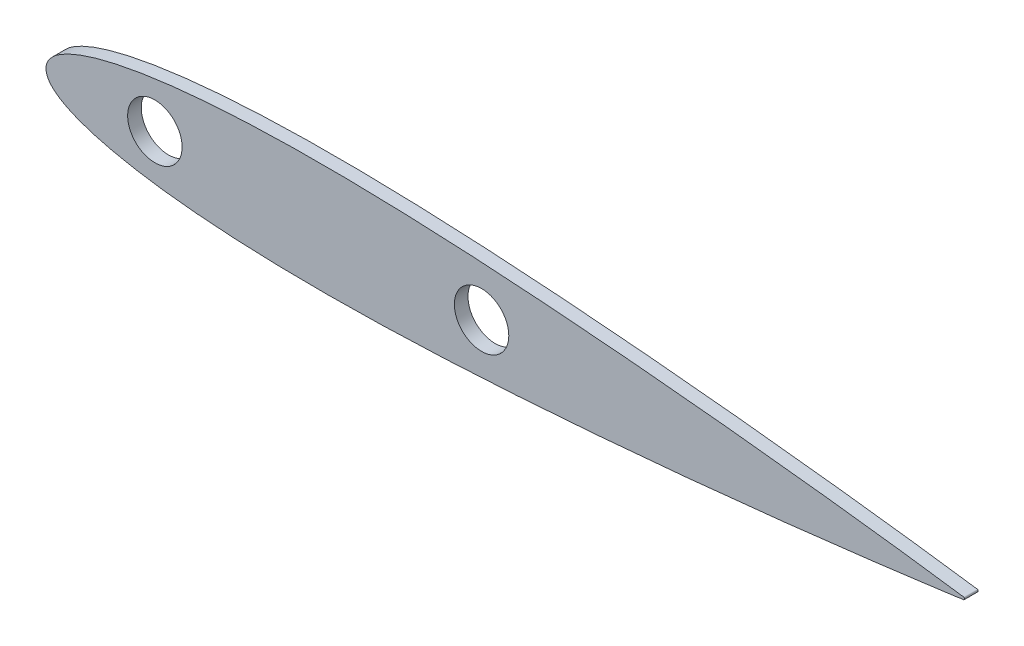
ISO-10303-21;
HEADER;
FILE_DESCRIPTION(('STEP AP214'),'2;1');
FILE_NAME('part.step','',(''),(''),'','','');
FILE_SCHEMA(('AUTOMOTIVE_DESIGN { 1 0 10303 214 1 1 1 1 }'));
ENDSEC;
DATA;
#1=APPLICATION_CONTEXT('core data for automotive mechanical design processes');
#2=APPLICATION_PROTOCOL_DEFINITION('international standard','automotive_design',2000,#1);
#3=PRODUCT_CONTEXT('',#1,'mechanical');
#4=PRODUCT('Part','Part','',(#3));
#5=PRODUCT_RELATED_PRODUCT_CATEGORY('part','',(#4));
#6=PRODUCT_DEFINITION_FORMATION('','',#4);
#7=PRODUCT_DEFINITION_CONTEXT('part definition',#1,'design');
#8=PRODUCT_DEFINITION('design','',#6,#7);
#9=PRODUCT_DEFINITION_SHAPE('','',#8);
#10=(LENGTH_UNIT() NAMED_UNIT(*) SI_UNIT(.MILLI.,.METRE.));
#11=(NAMED_UNIT(*) PLANE_ANGLE_UNIT() SI_UNIT($,.RADIAN.));
#12=(NAMED_UNIT(*) SI_UNIT($,.STERADIAN.) SOLID_ANGLE_UNIT());
#13=UNCERTAINTY_MEASURE_WITH_UNIT(LENGTH_MEASURE(1.E-05),#10,'distance_accuracy_value','');
#14=(GEOMETRIC_REPRESENTATION_CONTEXT(3) GLOBAL_UNCERTAINTY_ASSIGNED_CONTEXT((#13)) GLOBAL_UNIT_ASSIGNED_CONTEXT((#10,
#11,#12)) REPRESENTATION_CONTEXT('',''));
#15=CARTESIAN_POINT('',(0.,0.,0.));
#16=DIRECTION('',(0.,0.,1.));
#17=DIRECTION('',(1.,0.,0.));
#18=AXIS2_PLACEMENT_3D('',#15,#16,#17);
#19=CARTESIAN_POINT('',(214.122,0.26979372,-3.175));
#20=CARTESIAN_POINT('',(214.042517560815,0.336401081243854,-3.175));
#21=CARTESIAN_POINT('',(213.528971008812,0.273510813659236,-3.175));
#22=CARTESIAN_POINT('',(212.614475706084,0.530942112134174,-3.175));
#23=CARTESIAN_POINT('',(210.93741297643,0.69005818023402,-3.175));
#24=CARTESIAN_POINT('',(208.678154780773,1.03154078288429,-3.175));
#25=CARTESIAN_POINT('',(205.767891793944,1.41261255706814,-3.175));
#26=CARTESIAN_POINT('',(202.258298365244,1.8822660000615,-3.175));
#27=CARTESIAN_POINT('',(198.15850540465,2.41316460028215,-3.175));
#28=CARTESIAN_POINT('',(193.498201345533,3.00425135927741,-3.175));
#29=CARTESIAN_POINT('',(188.304622899694,3.64517141354976,-3.175));
#30=CARTESIAN_POINT('',(182.610259265293,4.32725083103619,-3.175));
#31=CARTESIAN_POINT('',(176.450111776307,5.04202983623907,-3.175));
#32=CARTESIAN_POINT('',(169.862114854153,5.77977689195638,-3.175));
#33=CARTESIAN_POINT('',(162.886908751652,6.53148470383703,-3.175));
#34=CARTESIAN_POINT('',(155.567547263004,7.28781696456526,-3.175));
#35=CARTESIAN_POINT('',(147.949138879147,8.03901128357458,-3.175));
#36=CARTESIAN_POINT('',(140.078674392034,8.77452314910697,-3.175));
#37=CARTESIAN_POINT('',(132.004623531841,9.48469680818573,-3.175));
#38=CARTESIAN_POINT('',(123.77685377293,10.1576594283105,-3.175));
#39=CARTESIAN_POINT('',(115.445921161842,10.7824383271029,-3.175));
#40=CARTESIAN_POINT('',(107.063264355407,11.3474339858058,-3.175));
#41=CARTESIAN_POINT('',(98.6805322459567,11.8408328326721,-3.175));
#42=CARTESIAN_POINT('',(90.3493308385156,12.2501697678435,-3.175));
#43=CARTESIAN_POINT('',(82.1211133669292,12.5645294411525,-3.175));
#44=CARTESIAN_POINT('',(74.0463721558162,12.7736562598864,-3.175));
#45=CARTESIAN_POINT('',(66.1750074581299,12.8673356782165,-3.175));
#46=CARTESIAN_POINT('',(58.5553855531777,12.8381332578879,-3.175));
#47=CARTESIAN_POINT('',(51.2344833966952,12.6804083153224,-3.175));
#48=CARTESIAN_POINT('',(44.257364483312,12.390162695652,-3.175));
#49=CARTESIAN_POINT('',(37.6669743171648,11.966637161581,-3.175));
#50=CARTESIAN_POINT('',(31.5038176761954,11.4111060734603,-3.175));
#51=CARTESIAN_POINT('',(25.8056086917366,10.7279081528874,-3.175));
#52=CARTESIAN_POINT('',(20.6070797735584,9.92285640303968,-3.175));
#53=CARTESIAN_POINT('',(15.9397327494157,9.00435890137932,-3.175));
#54=CARTESIAN_POINT('',(11.8309235824545,7.98280134436973,-3.175));
#55=CARTESIAN_POINT('',(8.30400030891142,6.86814519210064,-3.175));
#56=CARTESIAN_POINT('',(5.37688201303167,5.67077191854433,-3.175));
#57=CARTESIAN_POINT('',(3.05890335649716,4.39878231679485,-3.175));
#58=CARTESIAN_POINT('',(1.35363115596886,3.04966587168943,-3.175));
#59=CARTESIAN_POINT('',(0.261418185550571,1.59078439078852,-3.175));
#60=CARTESIAN_POINT('',(-0.121830169011358,0.,-3.175));
#61=CARTESIAN_POINT('',(0.261418185550567,-1.5907843907885,-3.175));
#62=CARTESIAN_POINT('',(1.35363115596885,-3.04966587168942,-3.175));
#63=CARTESIAN_POINT('',(3.05890335649717,-4.39878231679486,-3.175));
#64=CARTESIAN_POINT('',(5.37688201303168,-5.67077191854434,-3.175));
#65=CARTESIAN_POINT('',(8.30400030891139,-6.86814519210063,-3.175));
#66=CARTESIAN_POINT('',(11.8309235824545,-7.98280134436973,-3.175));
#67=CARTESIAN_POINT('',(15.9397327494157,-9.00435890137932,-3.175));
#68=CARTESIAN_POINT('',(20.6070797735584,-9.92285640303967,-3.175));
#69=CARTESIAN_POINT('',(25.8056086917366,-10.7279081528874,-3.175));
#70=CARTESIAN_POINT('',(31.5038176761954,-11.4111060734603,-3.175));
#71=CARTESIAN_POINT('',(37.6669743171648,-11.966637161581,-3.175));
#72=CARTESIAN_POINT('',(44.257364483312,-12.390162695652,-3.175));
#73=CARTESIAN_POINT('',(51.2344833966952,-12.6804083153224,-3.175));
#74=CARTESIAN_POINT('',(58.5553855531778,-12.8381332578879,-3.175));
#75=CARTESIAN_POINT('',(66.1750074581299,-12.8673356782165,-3.175));
#76=CARTESIAN_POINT('',(74.0463721558162,-12.7736562598864,-3.175));
#77=CARTESIAN_POINT('',(82.1211133669292,-12.5645294411525,-3.175));
#78=CARTESIAN_POINT('',(90.3493308385156,-12.2501697678435,-3.175));
#79=CARTESIAN_POINT('',(98.6805322459566,-11.8408328326721,-3.175));
#80=CARTESIAN_POINT('',(107.063264355407,-11.3474339858058,-3.175));
#81=CARTESIAN_POINT('',(115.445921161842,-10.7824383271029,-3.175));
#82=CARTESIAN_POINT('',(123.77685377293,-10.1576594283105,-3.175));
#83=CARTESIAN_POINT('',(132.004623531841,-9.48469680818572,-3.175));
#84=CARTESIAN_POINT('',(140.078674392034,-8.77452314910697,-3.175));
#85=CARTESIAN_POINT('',(147.949138879147,-8.03901128357458,-3.175));
#86=CARTESIAN_POINT('',(155.567547263004,-7.28781696456527,-3.175));
#87=CARTESIAN_POINT('',(162.886908751652,-6.53148470383702,-3.175));
#88=CARTESIAN_POINT('',(169.862114854153,-5.77977689195639,-3.175));
#89=CARTESIAN_POINT('',(176.450111776307,-5.04202983623907,-3.175));
#90=CARTESIAN_POINT('',(182.610259265293,-4.32725083103619,-3.175));
#91=CARTESIAN_POINT('',(188.304622899694,-3.64517141354977,-3.175));
#92=CARTESIAN_POINT('',(193.498201345533,-3.0042513592774,-3.175));
#93=CARTESIAN_POINT('',(198.15850540465,-2.41316460028216,-3.175));
#94=CARTESIAN_POINT('',(202.258298365244,-1.8822660000615,-3.175));
#95=CARTESIAN_POINT('',(205.767891793944,-1.41261255706814,-3.175));
#96=CARTESIAN_POINT('',(208.678154780773,-1.0315407828843,-3.175));
#97=CARTESIAN_POINT('',(210.937412976431,-0.69005818023401,-3.175));
#98=CARTESIAN_POINT('',(212.614475706083,-0.530942112134185,-3.175));
#99=CARTESIAN_POINT('',(213.528971008813,-0.273510813659228,-3.175));
#100=CARTESIAN_POINT('',(214.250719430012,-0.361898032229822,-3.175));
#101=CARTESIAN_POINT('',(214.250719430012,0.161925093145306,-3.175));
#102=CARTESIAN_POINT('',(214.122,0.26979372,-3.175));
#103=B_SPLINE_CURVE_WITH_KNOTS('',3,(#19,#20,#21,#22,#23,#24,#25,#26,#27,#28,#29,#30,#31,#32,
#33,#34,#35,#36,#37,#38,#39,#40,#41,#42,#43,#44,#45,#46,#47,#48,#49,#50,#51,#52,#53,#54,#55,#56,
#57,#58,#59,#60,#61,#62,#63,#64,#65,#66,#67,#68,#69,#70,#71,#72,#73,#74,#75,#76,#77,#78,#79,#80,
#81,#82,#83,#84,#85,#86,#87,#88,#89,#90,#91,#92,#93,#94,#95,#96,#97,#98,#99,#100,#101,#102),
.UNSPECIFIED.,.T.,.F.,(4,1,1,1,1,1,1,1,1,1,1,1,1,1,1,1,1,1,1,1,1,1,1,1,1,1,1,1,1,1,1,1,1,1,1,1,
1,1,1,1,1,1,1,1,1,1,1,1,1,1,1,1,1,1,1,1,1,1,1,1,1,1,1,1,1,1,1,1,1,1,1,1,1,1,1,1,1,1,1,1,1,4),
(0.,0.000762214651028502,0.00304470631082166,0.00683224554312915,0.0121011758037585,
0.0188175356586857,0.026939454793122,0.0364148482585567,0.0471846285955963,0.0591804130998147,
0.0723278736139124,0.0865440610891482,0.101740580336553,0.117823336433574,0.134691452208322,
0.152240154447154,0.170361289964637,0.188941007849542,0.207865435445639,0.227016078022501,
0.246275695980001,0.265524943249895,0.284644966110444,0.303520118268661,0.322034575374331,
0.340078352914118,0.357542593241702,0.374325481920834,0.390329890871888,0.405463889739094,
0.419643801445684,0.43279337139134,0.444843816743186,0.455737920704734,0.465428653233084,
0.473886320085415,0.481101634077568,0.487101684418678,0.491975368345093,0.495930677807379,
0.499382808099288,0.502834938391197,0.506790247853483,0.511663931779898,0.517663982121008,
0.524879296113161,0.533336962965492,0.543027695493842,0.55392179945539,0.565972244807236,
0.579121814752892,0.593301726459482,0.608435725326688,0.624440134277742,0.641223022956874,
0.658687263284458,0.676731040824245,0.695245497929915,0.714120650088133,0.733240672948681,
0.752489920218576,0.771749538176075,0.790900180752937,0.809824608349034,0.82840432623394,
0.846525461751422,0.864074163990254,0.880942279765002,0.897025035862024,0.912221555109428,
0.926437742584664,0.939585203098762,0.95158098760298,0.96235076794002,0.971826161405454,
0.979948080539891,0.986664440394818,0.991933370655447,0.995720909887755,0.998003401547548,
0.998765616198576,1.),.UNSPECIFIED.);
#104=DIRECTION('',(0.,0.,1.));
#105=VECTOR('',#104,1.);
#106=SURFACE_OF_LINEAR_EXTRUSION('',#103,#105);
#107=CARTESIAN_POINT('',(214.122,0.26979372,-3.175));
#108=VERTEX_POINT('',#107);
#109=EDGE_CURVE('E10',#108,#108,#103,.T.);
#110=ORIENTED_EDGE('',*,*,#109,.T.);
#111=EDGE_LOOP('',(#110));
#112=FACE_BOUND('',#111,.T.);
#113=CARTESIAN_POINT('',(214.122,0.26979372,0.));
#114=CARTESIAN_POINT('',(214.042517560815,0.336401081243854,0.));
#115=CARTESIAN_POINT('',(213.528971008812,0.273510813659236,0.));
#116=CARTESIAN_POINT('',(212.614475706084,0.530942112134174,0.));
#117=CARTESIAN_POINT('',(210.93741297643,0.69005818023402,0.));
#118=CARTESIAN_POINT('',(208.678154780773,1.03154078288429,0.));
#119=CARTESIAN_POINT('',(205.767891793944,1.41261255706814,0.));
#120=CARTESIAN_POINT('',(202.258298365244,1.8822660000615,0.));
#121=CARTESIAN_POINT('',(198.15850540465,2.41316460028215,0.));
#122=CARTESIAN_POINT('',(193.498201345533,3.00425135927741,0.));
#123=CARTESIAN_POINT('',(188.304622899694,3.64517141354976,0.));
#124=CARTESIAN_POINT('',(182.610259265293,4.32725083103619,0.));
#125=CARTESIAN_POINT('',(176.450111776307,5.04202983623907,0.));
#126=CARTESIAN_POINT('',(169.862114854153,5.77977689195638,0.));
#127=CARTESIAN_POINT('',(162.886908751652,6.53148470383703,0.));
#128=CARTESIAN_POINT('',(155.567547263004,7.28781696456526,0.));
#129=CARTESIAN_POINT('',(147.949138879147,8.03901128357458,0.));
#130=CARTESIAN_POINT('',(140.078674392034,8.77452314910697,0.));
#131=CARTESIAN_POINT('',(132.004623531841,9.48469680818573,0.));
#132=CARTESIAN_POINT('',(123.77685377293,10.1576594283105,0.));
#133=CARTESIAN_POINT('',(115.445921161842,10.7824383271029,0.));
#134=CARTESIAN_POINT('',(107.063264355407,11.3474339858058,0.));
#135=CARTESIAN_POINT('',(98.6805322459567,11.8408328326721,0.));
#136=CARTESIAN_POINT('',(90.3493308385156,12.2501697678435,0.));
#137=CARTESIAN_POINT('',(82.1211133669292,12.5645294411525,0.));
#138=CARTESIAN_POINT('',(74.0463721558162,12.7736562598864,0.));
#139=CARTESIAN_POINT('',(66.1750074581299,12.8673356782165,0.));
#140=CARTESIAN_POINT('',(58.5553855531777,12.8381332578879,0.));
#141=CARTESIAN_POINT('',(51.2344833966952,12.6804083153224,0.));
#142=CARTESIAN_POINT('',(44.257364483312,12.390162695652,0.));
#143=CARTESIAN_POINT('',(37.6669743171648,11.966637161581,0.));
#144=CARTESIAN_POINT('',(31.5038176761954,11.4111060734603,0.));
#145=CARTESIAN_POINT('',(25.8056086917366,10.7279081528874,0.));
#146=CARTESIAN_POINT('',(20.6070797735584,9.92285640303968,0.));
#147=CARTESIAN_POINT('',(15.9397327494157,9.00435890137932,0.));
#148=CARTESIAN_POINT('',(11.8309235824545,7.98280134436973,0.));
#149=CARTESIAN_POINT('',(8.30400030891142,6.86814519210064,0.));
#150=CARTESIAN_POINT('',(5.37688201303167,5.67077191854433,0.));
#151=CARTESIAN_POINT('',(3.05890335649716,4.39878231679485,0.));
#152=CARTESIAN_POINT('',(1.35363115596886,3.04966587168943,0.));
#153=CARTESIAN_POINT('',(0.261418185550571,1.59078439078852,0.));
#154=CARTESIAN_POINT('',(-0.121830169011358,0.,0.));
#155=CARTESIAN_POINT('',(0.261418185550567,-1.5907843907885,0.));
#156=CARTESIAN_POINT('',(1.35363115596885,-3.04966587168942,0.));
#157=CARTESIAN_POINT('',(3.05890335649717,-4.39878231679486,0.));
#158=CARTESIAN_POINT('',(5.37688201303168,-5.67077191854434,0.));
#159=CARTESIAN_POINT('',(8.30400030891139,-6.86814519210063,0.));
#160=CARTESIAN_POINT('',(11.8309235824545,-7.98280134436973,0.));
#161=CARTESIAN_POINT('',(15.9397327494157,-9.00435890137932,0.));
#162=CARTESIAN_POINT('',(20.6070797735584,-9.92285640303967,0.));
#163=CARTESIAN_POINT('',(25.8056086917366,-10.7279081528874,0.));
#164=CARTESIAN_POINT('',(31.5038176761954,-11.4111060734603,0.));
#165=CARTESIAN_POINT('',(37.6669743171648,-11.966637161581,0.));
#166=CARTESIAN_POINT('',(44.257364483312,-12.390162695652,0.));
#167=CARTESIAN_POINT('',(51.2344833966952,-12.6804083153224,0.));
#168=CARTESIAN_POINT('',(58.5553855531778,-12.8381332578879,0.));
#169=CARTESIAN_POINT('',(66.1750074581299,-12.8673356782165,0.));
#170=CARTESIAN_POINT('',(74.0463721558162,-12.7736562598864,0.));
#171=CARTESIAN_POINT('',(82.1211133669292,-12.5645294411525,0.));
#172=CARTESIAN_POINT('',(90.3493308385156,-12.2501697678435,0.));
#173=CARTESIAN_POINT('',(98.6805322459566,-11.8408328326721,0.));
#174=CARTESIAN_POINT('',(107.063264355407,-11.3474339858058,0.));
#175=CARTESIAN_POINT('',(115.445921161842,-10.7824383271029,0.));
#176=CARTESIAN_POINT('',(123.77685377293,-10.1576594283105,0.));
#177=CARTESIAN_POINT('',(132.004623531841,-9.48469680818572,0.));
#178=CARTESIAN_POINT('',(140.078674392034,-8.77452314910697,0.));
#179=CARTESIAN_POINT('',(147.949138879147,-8.03901128357458,0.));
#180=CARTESIAN_POINT('',(155.567547263004,-7.28781696456527,0.));
#181=CARTESIAN_POINT('',(162.886908751652,-6.53148470383702,0.));
#182=CARTESIAN_POINT('',(169.862114854153,-5.77977689195639,0.));
#183=CARTESIAN_POINT('',(176.450111776307,-5.04202983623907,0.));
#184=CARTESIAN_POINT('',(182.610259265293,-4.32725083103619,0.));
#185=CARTESIAN_POINT('',(188.304622899694,-3.64517141354977,0.));
#186=CARTESIAN_POINT('',(193.498201345533,-3.0042513592774,0.));
#187=CARTESIAN_POINT('',(198.15850540465,-2.41316460028216,0.));
#188=CARTESIAN_POINT('',(202.258298365244,-1.8822660000615,0.));
#189=CARTESIAN_POINT('',(205.767891793944,-1.41261255706814,0.));
#190=CARTESIAN_POINT('',(208.678154780773,-1.0315407828843,0.));
#191=CARTESIAN_POINT('',(210.937412976431,-0.69005818023401,0.));
#192=CARTESIAN_POINT('',(212.614475706083,-0.530942112134185,0.));
#193=CARTESIAN_POINT('',(213.528971008813,-0.273510813659228,0.));
#194=CARTESIAN_POINT('',(214.250719430012,-0.361898032229822,0.));
#195=CARTESIAN_POINT('',(214.250719430012,0.161925093145306,0.));
#196=CARTESIAN_POINT('',(214.122,0.26979372,0.));
#197=B_SPLINE_CURVE_WITH_KNOTS('',3,(#113,#114,#115,#116,#117,#118,#119,#120,#121,#122,#123,
#124,#125,#126,#127,#128,#129,#130,#131,#132,#133,#134,#135,#136,#137,#138,#139,#140,#141,#142,
#143,#144,#145,#146,#147,#148,#149,#150,#151,#152,#153,#154,#155,#156,#157,#158,#159,#160,#161,
#162,#163,#164,#165,#166,#167,#168,#169,#170,#171,#172,#173,#174,#175,#176,#177,#178,#179,#180,
#181,#182,#183,#184,#185,#186,#187,#188,#189,#190,#191,#192,#193,#194,#195,#196),.UNSPECIFIED.,
.T.,.F.,(4,1,1,1,1,1,1,1,1,1,1,1,1,1,1,1,1,1,1,1,1,1,1,1,1,1,1,1,1,1,1,1,1,1,1,1,1,1,1,1,1,1,1,
1,1,1,1,1,1,1,1,1,1,1,1,1,1,1,1,1,1,1,1,1,1,1,1,1,1,1,1,1,1,1,1,1,1,1,1,1,1,4),(0.,
0.000762214651028502,0.00304470631082166,0.00683224554312915,0.0121011758037585,
0.0188175356586857,0.026939454793122,0.0364148482585567,0.0471846285955963,0.0591804130998147,
0.0723278736139124,0.0865440610891482,0.101740580336553,0.117823336433574,0.134691452208322,
0.152240154447154,0.170361289964637,0.188941007849542,0.207865435445639,0.227016078022501,
0.246275695980001,0.265524943249895,0.284644966110444,0.303520118268661,0.322034575374331,
0.340078352914118,0.357542593241702,0.374325481920834,0.390329890871888,0.405463889739094,
0.419643801445684,0.43279337139134,0.444843816743186,0.455737920704734,0.465428653233084,
0.473886320085415,0.481101634077568,0.487101684418678,0.491975368345093,0.495930677807379,
0.499382808099288,0.502834938391197,0.506790247853483,0.511663931779898,0.517663982121008,
0.524879296113161,0.533336962965492,0.543027695493842,0.55392179945539,0.565972244807236,
0.579121814752892,0.593301726459482,0.608435725326688,0.624440134277742,0.641223022956874,
0.658687263284458,0.676731040824245,0.695245497929915,0.714120650088133,0.733240672948681,
0.752489920218576,0.771749538176075,0.790900180752937,0.809824608349034,0.82840432623394,
0.846525461751422,0.864074163990254,0.880942279765002,0.897025035862024,0.912221555109428,
0.926437742584664,0.939585203098762,0.95158098760298,0.96235076794002,0.971826161405454,
0.979948080539891,0.986664440394818,0.991933370655447,0.995720909887755,0.998003401547548,
0.998765616198576,1.),.UNSPECIFIED.);
#198=CARTESIAN_POINT('',(214.122,0.26979372,0.));
#199=VERTEX_POINT('',#198);
#200=EDGE_CURVE('E39',#199,#199,#197,.T.);
#201=ORIENTED_EDGE('',*,*,#200,.F.);
#202=EDGE_LOOP('',(#201));
#203=FACE_BOUND('',#202,.T.);
#204=ADVANCED_FACE('F35',(#112,#203),#106,.T.);
#205=CARTESIAN_POINT('',(0.0114796345108349,-0.270976882837512,-3.175));
#206=DIRECTION('',(0.,0.,1.));
#207=DIRECTION('',(-1.,0.,0.));
#208=AXIS2_PLACEMENT_3D('',#205,#206,#207);
#209=PLANE('',#208);
#210=CARTESIAN_POINT('',(25.4,0.,-3.175));
#211=DIRECTION('',(0.,0.,1.));
#212=DIRECTION('',(1.,0.,0.));
#213=AXIS2_PLACEMENT_3D('',#210,#211,#212);
#214=CIRCLE('',#213,6.35);
#215=CARTESIAN_POINT('',(31.75,0.,-3.175));
#216=VERTEX_POINT('',#215);
#217=EDGE_CURVE('E61',#216,#216,#214,.T.);
#218=ORIENTED_EDGE('',*,*,#217,.T.);
#219=EDGE_LOOP('',(#218));
#220=FACE_BOUND('',#219,.T.);
#221=CARTESIAN_POINT('',(101.6,0.,-3.175));
#222=DIRECTION('',(0.,0.,1.));
#223=DIRECTION('',(1.,0.,0.));
#224=AXIS2_PLACEMENT_3D('',#221,#222,#223);
#225=CIRCLE('',#224,6.35);
#226=CARTESIAN_POINT('',(107.95,0.,-3.175));
#227=VERTEX_POINT('',#226);
#228=EDGE_CURVE('E52',#227,#227,#225,.T.);
#229=ORIENTED_EDGE('',*,*,#228,.T.);
#230=EDGE_LOOP('',(#229));
#231=FACE_BOUND('',#230,.T.);
#232=ORIENTED_EDGE('',*,*,#109,.F.);
#233=EDGE_LOOP('',(#232));
#234=FACE_BOUND('',#233,.T.);
#235=ADVANCED_FACE('F74',(#220,#231,#234),#209,.F.);
#236=CARTESIAN_POINT('',(0.0114796345108349,-0.270976882837512,0.));
#237=DIRECTION('',(0.,0.,1.));
#238=DIRECTION('',(-1.,0.,0.));
#239=AXIS2_PLACEMENT_3D('',#236,#237,#238);
#240=PLANE('',#239);
#241=CARTESIAN_POINT('',(25.4,0.,0.));
#242=DIRECTION('',(0.,0.,1.));
#243=DIRECTION('',(1.,0.,0.));
#244=AXIS2_PLACEMENT_3D('',#241,#242,#243);
#245=CIRCLE('',#244,6.35);
#246=CARTESIAN_POINT('',(31.75,0.,0.));
#247=VERTEX_POINT('',#246);
#248=EDGE_CURVE('E47',#247,#247,#245,.T.);
#249=ORIENTED_EDGE('',*,*,#248,.F.);
#250=EDGE_LOOP('',(#249));
#251=FACE_BOUND('',#250,.T.);
#252=CARTESIAN_POINT('',(101.6,0.,0.));
#253=DIRECTION('',(0.,0.,1.));
#254=DIRECTION('',(1.,0.,0.));
#255=AXIS2_PLACEMENT_3D('',#252,#253,#254);
#256=CIRCLE('',#255,6.35);
#257=CARTESIAN_POINT('',(107.95,0.,0.));
#258=VERTEX_POINT('',#257);
#259=EDGE_CURVE('E58',#258,#258,#256,.T.);
#260=ORIENTED_EDGE('',*,*,#259,.F.);
#261=EDGE_LOOP('',(#260));
#262=FACE_BOUND('',#261,.T.);
#263=ORIENTED_EDGE('',*,*,#200,.T.);
#264=EDGE_LOOP('',(#263));
#265=FACE_BOUND('',#264,.T.);
#266=ADVANCED_FACE('F70',(#251,#262,#265),#240,.T.);
#267=CARTESIAN_POINT('',(101.6,0.,0.));
#268=DIRECTION('',(0.,0.,-1.));
#269=DIRECTION('',(1.,0.,0.));
#270=AXIS2_PLACEMENT_3D('',#267,#268,#269);
#271=CYLINDRICAL_SURFACE('',#270,6.35);
#272=ORIENTED_EDGE('',*,*,#259,.T.);
#273=EDGE_LOOP('',(#272));
#274=FACE_BOUND('',#273,.T.);
#275=ORIENTED_EDGE('',*,*,#228,.F.);
#276=EDGE_LOOP('',(#275));
#277=FACE_BOUND('',#276,.T.);
#278=ADVANCED_FACE('F73',(#274,#277),#271,.F.);
#279=CARTESIAN_POINT('',(25.4,0.,0.));
#280=DIRECTION('',(0.,0.,-1.));
#281=DIRECTION('',(1.,0.,0.));
#282=AXIS2_PLACEMENT_3D('',#279,#280,#281);
#283=CYLINDRICAL_SURFACE('',#282,6.35);
#284=ORIENTED_EDGE('',*,*,#248,.T.);
#285=EDGE_LOOP('',(#284));
#286=FACE_BOUND('',#285,.T.);
#287=ORIENTED_EDGE('',*,*,#217,.F.);
#288=EDGE_LOOP('',(#287));
#289=FACE_BOUND('',#288,.T.);
#290=ADVANCED_FACE('F67',(#286,#289),#283,.F.);
#291=CLOSED_SHELL('',(#204,#235,#266,#278,#290));
#292=MANIFOLD_SOLID_BREP('B2',#291);
#293=ADVANCED_BREP_SHAPE_REPRESENTATION('',(#18,#292),#14);
#294=SHAPE_DEFINITION_REPRESENTATION(#9,#293);
ENDSEC;
END-ISO-10303-21;
